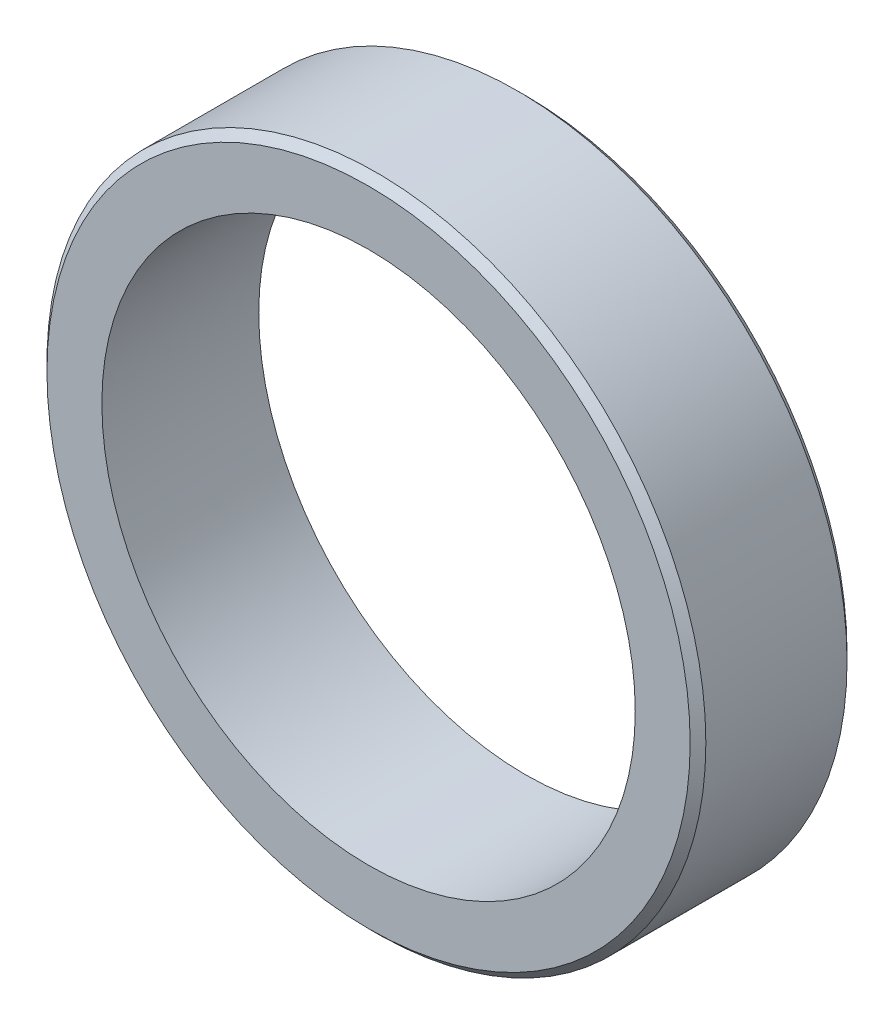
ISO-10303-21;
HEADER;
FILE_DESCRIPTION(('STEP AP214'),'2;1');
FILE_NAME('part.step','',(''),(''),'','','');
FILE_SCHEMA(('AUTOMOTIVE_DESIGN { 1 0 10303 214 1 1 1 1 }'));
ENDSEC;
DATA;
#1=APPLICATION_CONTEXT('core data for automotive mechanical design processes');
#2=APPLICATION_PROTOCOL_DEFINITION('international standard','automotive_design',2000,#1);
#3=PRODUCT_CONTEXT('',#1,'mechanical');
#4=PRODUCT('Part','Part','',(#3));
#5=PRODUCT_RELATED_PRODUCT_CATEGORY('part','',(#4));
#6=PRODUCT_DEFINITION_FORMATION('','',#4);
#7=PRODUCT_DEFINITION_CONTEXT('part definition',#1,'design');
#8=PRODUCT_DEFINITION('design','',#6,#7);
#9=PRODUCT_DEFINITION_SHAPE('','',#8);
#10=(LENGTH_UNIT() NAMED_UNIT(*) SI_UNIT(.MILLI.,.METRE.));
#11=(NAMED_UNIT(*) PLANE_ANGLE_UNIT() SI_UNIT($,.RADIAN.));
#12=(NAMED_UNIT(*) SI_UNIT($,.STERADIAN.) SOLID_ANGLE_UNIT());
#13=UNCERTAINTY_MEASURE_WITH_UNIT(LENGTH_MEASURE(1.E-05),#10,'distance_accuracy_value','');
#14=(GEOMETRIC_REPRESENTATION_CONTEXT(3) GLOBAL_UNCERTAINTY_ASSIGNED_CONTEXT((#13)) GLOBAL_UNIT_ASSIGNED_CONTEXT((#10,
#11,#12)) REPRESENTATION_CONTEXT('',''));
#15=CARTESIAN_POINT('',(0.,0.,0.));
#16=DIRECTION('',(0.,0.,1.));
#17=DIRECTION('',(1.,0.,0.));
#18=AXIS2_PLACEMENT_3D('',#15,#16,#17);
#19=CARTESIAN_POINT('',(0.,0.,100.));
#20=DIRECTION('',(0.,0.,1.));
#21=DIRECTION('',(1.,0.,0.));
#22=AXIS2_PLACEMENT_3D('',#19,#20,#21);
#23=PLANE('',#22);
#24=CARTESIAN_POINT('',(0.,0.,100.));
#25=DIRECTION('',(0.,0.,1.));
#26=DIRECTION('',(1.,0.,0.));
#27=AXIS2_PLACEMENT_3D('',#24,#25,#26);
#28=CIRCLE('',#27,410.);
#29=CARTESIAN_POINT('',(410.,0.,100.));
#30=VERTEX_POINT('',#29);
#31=EDGE_CURVE('E10',#30,#30,#28,.T.);
#32=ORIENTED_EDGE('',*,*,#31,.T.);
#33=EDGE_LOOP('',(#32));
#34=FACE_BOUND('',#33,.T.);
#35=CARTESIAN_POINT('',(0.,0.,100.));
#36=DIRECTION('',(0.,0.,1.));
#37=DIRECTION('',(1.,0.,0.));
#38=AXIS2_PLACEMENT_3D('',#35,#36,#37);
#39=CIRCLE('',#38,340.);
#40=CARTESIAN_POINT('',(340.,0.,100.));
#41=VERTEX_POINT('',#40);
#42=EDGE_CURVE('E60',#41,#41,#39,.T.);
#43=ORIENTED_EDGE('',*,*,#42,.F.);
#44=EDGE_LOOP('',(#43));
#45=FACE_BOUND('',#44,.T.);
#46=ADVANCED_FACE('F39',(#34,#45),#23,.T.);
#47=CARTESIAN_POINT('',(0.,0.,-100.));
#48=DIRECTION('',(0.,0.,1.));
#49=DIRECTION('',(1.,0.,0.));
#50=AXIS2_PLACEMENT_3D('',#47,#48,#49);
#51=PLANE('',#50);
#52=CARTESIAN_POINT('',(0.,0.,-100.));
#53=DIRECTION('',(0.,0.,1.));
#54=DIRECTION('',(1.,0.,0.));
#55=AXIS2_PLACEMENT_3D('',#52,#53,#54);
#56=CIRCLE('',#55,410.);
#57=CARTESIAN_POINT('',(410.,0.,-100.));
#58=VERTEX_POINT('',#57);
#59=EDGE_CURVE('E47',#58,#58,#56,.F.);
#60=ORIENTED_EDGE('',*,*,#59,.T.);
#61=EDGE_LOOP('',(#60));
#62=FACE_BOUND('',#61,.T.);
#63=CARTESIAN_POINT('',(0.,0.,-100.));
#64=DIRECTION('',(0.,0.,1.));
#65=DIRECTION('',(1.,0.,0.));
#66=AXIS2_PLACEMENT_3D('',#63,#64,#65);
#67=CIRCLE('',#66,340.);
#68=CARTESIAN_POINT('',(340.,0.,-100.));
#69=VERTEX_POINT('',#68);
#70=EDGE_CURVE('E61',#69,#69,#67,.T.);
#71=ORIENTED_EDGE('',*,*,#70,.T.);
#72=EDGE_LOOP('',(#71));
#73=FACE_BOUND('',#72,.T.);
#74=ADVANCED_FACE('F71',(#62,#73),#51,.F.);
#75=CARTESIAN_POINT('',(0.,0.,100.));
#76=DIRECTION('',(0.,0.,-1.));
#77=DIRECTION('',(-1.,0.,0.));
#78=AXIS2_PLACEMENT_3D('',#75,#76,#77);
#79=CYLINDRICAL_SURFACE('',#78,420.);
#80=CARTESIAN_POINT('',(0.,0.,-89.9999999999999));
#81=DIRECTION('',(0.,0.,1.));
#82=DIRECTION('',(1.,0.,0.));
#83=AXIS2_PLACEMENT_3D('',#80,#81,#82);
#84=CIRCLE('',#83,420.);
#85=CARTESIAN_POINT('',(420.,0.,-89.9999999999999));
#86=VERTEX_POINT('',#85);
#87=EDGE_CURVE('E51',#86,#86,#84,.T.);
#88=ORIENTED_EDGE('',*,*,#87,.T.);
#89=EDGE_LOOP('',(#88));
#90=FACE_BOUND('',#89,.T.);
#91=CARTESIAN_POINT('',(0.,0.,90.));
#92=DIRECTION('',(0.,0.,1.));
#93=DIRECTION('',(1.,0.,0.));
#94=AXIS2_PLACEMENT_3D('',#91,#92,#93);
#95=CIRCLE('',#94,420.);
#96=CARTESIAN_POINT('',(420.,0.,90.));
#97=VERTEX_POINT('',#96);
#98=EDGE_CURVE('E55',#97,#97,#95,.F.);
#99=ORIENTED_EDGE('',*,*,#98,.T.);
#100=EDGE_LOOP('',(#99));
#101=FACE_BOUND('',#100,.T.);
#102=ADVANCED_FACE('F77',(#90,#101),#79,.T.);
#103=CARTESIAN_POINT('',(0.,0.,100.));
#104=DIRECTION('',(0.,0.,-1.));
#105=DIRECTION('',(-1.,0.,0.));
#106=AXIS2_PLACEMENT_3D('',#103,#104,#105);
#107=CYLINDRICAL_SURFACE('',#106,340.);
#108=ORIENTED_EDGE('',*,*,#42,.T.);
#109=EDGE_LOOP('',(#108));
#110=FACE_BOUND('',#109,.T.);
#111=ORIENTED_EDGE('',*,*,#70,.F.);
#112=EDGE_LOOP('',(#111));
#113=FACE_BOUND('',#112,.T.);
#114=ADVANCED_FACE('F67',(#110,#113),#107,.F.);
#115=CARTESIAN_POINT('',(0.,0.,-89.9999999999999));
#116=DIRECTION('',(0.,0.,1.));
#117=DIRECTION('',(1.,0.,0.));
#118=AXIS2_PLACEMENT_3D('',#115,#116,#117);
#119=CONICAL_SURFACE('',#118,420.,0.785398163397446);
#120=ORIENTED_EDGE('',*,*,#59,.F.);
#121=EDGE_LOOP('',(#120));
#122=FACE_BOUND('',#121,.T.);
#123=ORIENTED_EDGE('',*,*,#87,.F.);
#124=EDGE_LOOP('',(#123));
#125=FACE_BOUND('',#124,.T.);
#126=ADVANCED_FACE('F84',(#122,#125),#119,.T.);
#127=CARTESIAN_POINT('',(0.,0.,100.));
#128=DIRECTION('',(0.,0.,-1.));
#129=DIRECTION('',(-1.,0.,0.));
#130=AXIS2_PLACEMENT_3D('',#127,#128,#129);
#131=CONICAL_SURFACE('',#130,410.,0.78539816339744);
#132=ORIENTED_EDGE('',*,*,#98,.F.);
#133=EDGE_LOOP('',(#132));
#134=FACE_BOUND('',#133,.T.);
#135=ORIENTED_EDGE('',*,*,#31,.F.);
#136=EDGE_LOOP('',(#135));
#137=FACE_BOUND('',#136,.T.);
#138=ADVANCED_FACE('F42',(#134,#137),#131,.T.);
#139=CLOSED_SHELL('',(#46,#74,#102,#114,#126,#138));
#140=MANIFOLD_SOLID_BREP('B2',#139);
#141=ADVANCED_BREP_SHAPE_REPRESENTATION('',(#18,#140),#14);
#142=SHAPE_DEFINITION_REPRESENTATION(#9,#141);
ENDSEC;
END-ISO-10303-21;
